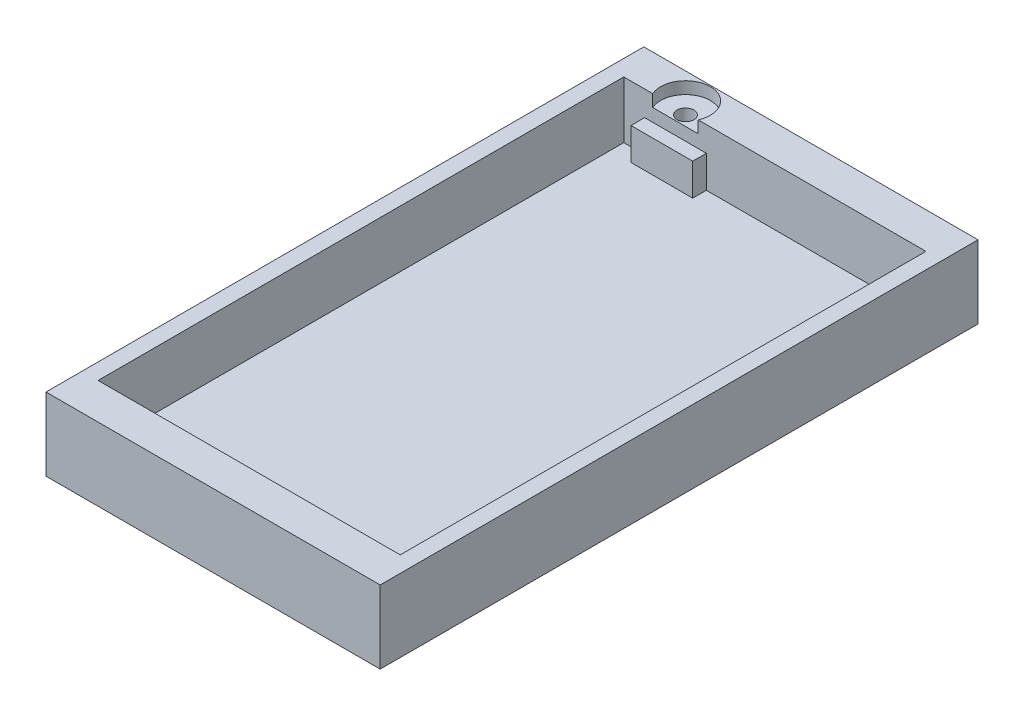
ISO-10303-21;
HEADER;
FILE_DESCRIPTION(('STEP AP214'),'2;1');
FILE_NAME('part.step','',(''),(''),'','','');
FILE_SCHEMA(('AUTOMOTIVE_DESIGN { 1 0 10303 214 1 1 1 1 }'));
ENDSEC;
DATA;
#1=APPLICATION_CONTEXT('core data for automotive mechanical design processes');
#2=APPLICATION_PROTOCOL_DEFINITION('international standard','automotive_design',2000,#1);
#3=PRODUCT_CONTEXT('',#1,'mechanical');
#4=PRODUCT('Part','Part','',(#3));
#5=PRODUCT_RELATED_PRODUCT_CATEGORY('part','',(#4));
#6=PRODUCT_DEFINITION_FORMATION('','',#4);
#7=PRODUCT_DEFINITION_CONTEXT('part definition',#1,'design');
#8=PRODUCT_DEFINITION('design','',#6,#7);
#9=PRODUCT_DEFINITION_SHAPE('','',#8);
#10=(LENGTH_UNIT() NAMED_UNIT(*) SI_UNIT(.MILLI.,.METRE.));
#11=(NAMED_UNIT(*) PLANE_ANGLE_UNIT() SI_UNIT($,.RADIAN.));
#12=(NAMED_UNIT(*) SI_UNIT($,.STERADIAN.) SOLID_ANGLE_UNIT());
#13=UNCERTAINTY_MEASURE_WITH_UNIT(LENGTH_MEASURE(1.E-05),#10,'distance_accuracy_value','');
#14=(GEOMETRIC_REPRESENTATION_CONTEXT(3) GLOBAL_UNCERTAINTY_ASSIGNED_CONTEXT((#13)) GLOBAL_UNIT_ASSIGNED_CONTEXT((#10,
#11,#12)) REPRESENTATION_CONTEXT('',''));
#15=CARTESIAN_POINT('',(0.,0.,0.));
#16=DIRECTION('',(0.,0.,1.));
#17=DIRECTION('',(1.,0.,0.));
#18=AXIS2_PLACEMENT_3D('',#15,#16,#17);
#19=CARTESIAN_POINT('',(0.,3.1,0.));
#20=DIRECTION('',(0.,1.,0.));
#21=DIRECTION('',(0.,0.,1.));
#22=AXIS2_PLACEMENT_3D('',#19,#20,#21);
#23=PLANE('',#22);
#24=DIRECTION('',(0.,0.,1.));
#25=VECTOR('',#24,1.);
#26=CARTESIAN_POINT('',(-20.85,3.1,-37.3));
#27=LINE('',#26,#25);
#28=CARTESIAN_POINT('',(-20.85,3.1,-37.3));
#29=VERTEX_POINT('',#28);
#30=CARTESIAN_POINT('',(-20.85,3.1,37.3));
#31=VERTEX_POINT('',#30);
#32=EDGE_CURVE('E208',#29,#31,#27,.T.);
#33=ORIENTED_EDGE('',*,*,#32,.T.);
#34=DIRECTION('',(1.,0.,0.));
#35=VECTOR('',#34,1.);
#36=CARTESIAN_POINT('',(-20.85,3.1,37.3));
#37=LINE('',#36,#35);
#38=CARTESIAN_POINT('',(20.85,3.1,37.3));
#39=VERTEX_POINT('',#38);
#40=EDGE_CURVE('E202',#31,#39,#37,.T.);
#41=ORIENTED_EDGE('',*,*,#40,.T.);
#42=DIRECTION('',(0.,0.,-1.));
#43=VECTOR('',#42,1.);
#44=CARTESIAN_POINT('',(20.85,3.1,-37.3));
#45=LINE('',#44,#43);
#46=CARTESIAN_POINT('',(20.85,3.1,-37.3));
#47=VERTEX_POINT('',#46);
#48=EDGE_CURVE('E205',#39,#47,#45,.T.);
#49=ORIENTED_EDGE('',*,*,#48,.T.);
#50=DIRECTION('',(-1.,0.,0.));
#51=VECTOR('',#50,1.);
#52=CARTESIAN_POINT('',(-20.85,3.1,-37.3));
#53=LINE('',#52,#51);
#54=EDGE_CURVE('E200',#47,#29,#53,.T.);
#55=ORIENTED_EDGE('',*,*,#54,.T.);
#56=EDGE_LOOP('',(#33,#41,#49,#55));
#57=FACE_BOUND('',#56,.T.);
#58=CARTESIAN_POINT('',(-12.4,3.1,-34.05));
#59=DIRECTION('',(0.,1.,0.));
#60=DIRECTION('',(0.,0.,1.));
#61=AXIS2_PLACEMENT_3D('',#58,#59,#60);
#62=CIRCLE('',#61,3.1);
#63=CARTESIAN_POINT('',(-9.56318840949914,3.1,-32.8));
#64=VERTEX_POINT('',#63);
#65=CARTESIAN_POINT('',(-15.2368115905009,3.1,-32.8));
#66=VERTEX_POINT('',#65);
#67=EDGE_CURVE('E175',#64,#66,#62,.T.);
#68=ORIENTED_EDGE('',*,*,#67,.F.);
#69=DIRECTION('',(-1.,0.,0.));
#70=VECTOR('',#69,1.);
#71=CARTESIAN_POINT('',(-18.85,3.1,-32.8));
#72=LINE('',#71,#70);
#73=CARTESIAN_POINT('',(18.85,3.1,-32.8));
#74=VERTEX_POINT('',#73);
#75=EDGE_CURVE('E180',#74,#64,#72,.T.);
#76=ORIENTED_EDGE('',*,*,#75,.F.);
#77=DIRECTION('',(0.,0.,-1.));
#78=VECTOR('',#77,1.);
#79=CARTESIAN_POINT('',(18.85,3.1,-32.8));
#80=LINE('',#79,#78);
#81=CARTESIAN_POINT('',(18.85,3.1,32.8));
#82=VERTEX_POINT('',#81);
#83=EDGE_CURVE('E225',#82,#74,#80,.T.);
#84=ORIENTED_EDGE('',*,*,#83,.F.);
#85=DIRECTION('',(1.,0.,0.));
#86=VECTOR('',#85,1.);
#87=CARTESIAN_POINT('',(-18.85,3.1,32.8));
#88=LINE('',#87,#86);
#89=CARTESIAN_POINT('',(-18.85,3.1,32.8));
#90=VERTEX_POINT('',#89);
#91=EDGE_CURVE('E223',#90,#82,#88,.T.);
#92=ORIENTED_EDGE('',*,*,#91,.F.);
#93=DIRECTION('',(0.,0.,1.));
#94=VECTOR('',#93,1.);
#95=CARTESIAN_POINT('',(-18.85,3.1,-32.8));
#96=LINE('',#95,#94);
#97=CARTESIAN_POINT('',(-18.85,3.1,-32.8));
#98=VERTEX_POINT('',#97);
#99=EDGE_CURVE('E230',#98,#90,#96,.T.);
#100=ORIENTED_EDGE('',*,*,#99,.F.);
#101=EDGE_CURVE('E222',#66,#98,#72,.T.);
#102=ORIENTED_EDGE('',*,*,#101,.F.);
#103=EDGE_LOOP('',(#68,#76,#84,#92,#100,#102));
#104=FACE_BOUND('',#103,.T.);
#105=ADVANCED_FACE('F39',(#57,#104),#23,.T.);
#106=CARTESIAN_POINT('',(-18.85,3.1,-32.8));
#107=DIRECTION('',(0.,0.,1.));
#108=DIRECTION('',(1.,0.,0.));
#109=AXIS2_PLACEMENT_3D('',#106,#107,#108);
#110=PLANE('',#109);
#111=DIRECTION('',(-1.,0.,0.));
#112=VECTOR('',#111,1.);
#113=CARTESIAN_POINT('',(-18.85,1.6,-32.8));
#114=LINE('',#113,#112);
#115=CARTESIAN_POINT('',(-9.56318840949914,1.6,-32.8));
#116=VERTEX_POINT('',#115);
#117=CARTESIAN_POINT('',(-15.2368115905009,1.6,-32.8));
#118=VERTEX_POINT('',#117);
#119=EDGE_CURVE('E163',#116,#118,#114,.T.);
#120=ORIENTED_EDGE('',*,*,#119,.T.);
#121=DIRECTION('',(0.,-1.,0.));
#122=VECTOR('',#121,1.);
#123=CARTESIAN_POINT('',(-15.2368115905009,3.1,-32.8));
#124=LINE('',#123,#122);
#125=EDGE_CURVE('E11',#118,#66,#124,.F.);
#126=ORIENTED_EDGE('',*,*,#125,.T.);
#127=ORIENTED_EDGE('',*,*,#101,.T.);
#128=DIRECTION('',(0.,-1.,0.));
#129=VECTOR('',#128,1.);
#130=CARTESIAN_POINT('',(-18.85,3.1,-32.8));
#131=LINE('',#130,#129);
#132=CARTESIAN_POINT('',(-18.85,-4.,-32.8));
#133=VERTEX_POINT('',#132);
#134=EDGE_CURVE('E220',#98,#133,#131,.T.);
#135=ORIENTED_EDGE('',*,*,#134,.T.);
#136=DIRECTION('',(-1.,0.,0.));
#137=VECTOR('',#136,1.);
#138=CARTESIAN_POINT('',(-18.85,-4.,-32.8));
#139=LINE('',#138,#137);
#140=CARTESIAN_POINT('',(-16.25,-4.,-32.8));
#141=VERTEX_POINT('',#140);
#142=EDGE_CURVE('E235',#141,#133,#139,.T.);
#143=ORIENTED_EDGE('',*,*,#142,.F.);
#144=DIRECTION('',(0.,1.,0.));
#145=VECTOR('',#144,1.);
#146=CARTESIAN_POINT('',(-16.25,-4.,-32.8));
#147=LINE('',#146,#145);
#148=CARTESIAN_POINT('',(-16.25,0.,-32.8));
#149=VERTEX_POINT('',#148);
#150=EDGE_CURVE('E65',#141,#149,#147,.T.);
#151=ORIENTED_EDGE('',*,*,#150,.T.);
#152=DIRECTION('',(-1.,0.,0.));
#153=VECTOR('',#152,1.);
#154=CARTESIAN_POINT('',(-16.25,0.,-32.8));
#155=LINE('',#154,#153);
#156=CARTESIAN_POINT('',(-8.55,0.,-32.8));
#157=VERTEX_POINT('',#156);
#158=EDGE_CURVE('E285',#157,#149,#155,.T.);
#159=ORIENTED_EDGE('',*,*,#158,.F.);
#160=DIRECTION('',(0.,1.,0.));
#161=VECTOR('',#160,1.);
#162=CARTESIAN_POINT('',(-8.55,-4.,-32.8));
#163=LINE('',#162,#161);
#164=CARTESIAN_POINT('',(-8.55,-4.,-32.8));
#165=VERTEX_POINT('',#164);
#166=EDGE_CURVE('E279',#165,#157,#163,.T.);
#167=ORIENTED_EDGE('',*,*,#166,.F.);
#168=CARTESIAN_POINT('',(18.85,-4.,-32.8));
#169=VERTEX_POINT('',#168);
#170=EDGE_CURVE('E228',#169,#165,#139,.T.);
#171=ORIENTED_EDGE('',*,*,#170,.F.);
#172=DIRECTION('',(0.,-1.,0.));
#173=VECTOR('',#172,1.);
#174=CARTESIAN_POINT('',(18.85,3.1,-32.8));
#175=LINE('',#174,#173);
#176=EDGE_CURVE('E214',#74,#169,#175,.T.);
#177=ORIENTED_EDGE('',*,*,#176,.F.);
#178=ORIENTED_EDGE('',*,*,#75,.T.);
#179=DIRECTION('',(0.,-1.,0.));
#180=VECTOR('',#179,1.);
#181=CARTESIAN_POINT('',(-9.56318840949914,3.1,-32.8));
#182=LINE('',#181,#180);
#183=EDGE_CURVE('E48',#64,#116,#182,.T.);
#184=ORIENTED_EDGE('',*,*,#183,.T.);
#185=EDGE_LOOP('',(#120,#126,#127,#135,#143,#151,#159,#167,#171,#177,#178,#184));
#186=FACE_BOUND('',#185,.T.);
#187=ADVANCED_FACE('F174',(#186),#110,.T.);
#188=CARTESIAN_POINT('',(-18.85,3.1,32.8));
#189=DIRECTION('',(0.,0.,-1.));
#190=DIRECTION('',(-1.,0.,0.));
#191=AXIS2_PLACEMENT_3D('',#188,#189,#190);
#192=PLANE('',#191);
#193=DIRECTION('',(0.,-1.,0.));
#194=VECTOR('',#193,1.);
#195=CARTESIAN_POINT('',(-18.85,3.1,32.8));
#196=LINE('',#195,#194);
#197=CARTESIAN_POINT('',(-18.85,-4.,32.8));
#198=VERTEX_POINT('',#197);
#199=EDGE_CURVE('E211',#90,#198,#196,.T.);
#200=ORIENTED_EDGE('',*,*,#199,.F.);
#201=ORIENTED_EDGE('',*,*,#91,.T.);
#202=DIRECTION('',(0.,-1.,0.));
#203=VECTOR('',#202,1.);
#204=CARTESIAN_POINT('',(18.85,3.1,32.8));
#205=LINE('',#204,#203);
#206=CARTESIAN_POINT('',(18.85,-4.,32.8));
#207=VERTEX_POINT('',#206);
#208=EDGE_CURVE('E213',#82,#207,#205,.T.);
#209=ORIENTED_EDGE('',*,*,#208,.T.);
#210=DIRECTION('',(1.,0.,0.));
#211=VECTOR('',#210,1.);
#212=CARTESIAN_POINT('',(-18.85,-4.,32.8));
#213=LINE('',#212,#211);
#214=EDGE_CURVE('E237',#198,#207,#213,.T.);
#215=ORIENTED_EDGE('',*,*,#214,.F.);
#216=EDGE_LOOP('',(#200,#201,#209,#215));
#217=FACE_BOUND('',#216,.T.);
#218=DIRECTION('',(0.,-1.,0.));
#219=VECTOR('',#218,1.);
#220=CARTESIAN_POINT('',(18.4,1.75,32.8));
#221=LINE('',#220,#219);
#222=CARTESIAN_POINT('',(18.4,1.75,32.8));
#223=VERTEX_POINT('',#222);
#224=CARTESIAN_POINT('',(18.4,-0.15,32.8));
#225=VERTEX_POINT('',#224);
#226=EDGE_CURVE('E247',#223,#225,#221,.T.);
#227=ORIENTED_EDGE('',*,*,#226,.F.);
#228=DIRECTION('',(-1.,0.,0.));
#229=VECTOR('',#228,1.);
#230=CARTESIAN_POINT('',(-18.4,1.75,32.8));
#231=LINE('',#230,#229);
#232=CARTESIAN_POINT('',(-18.4,1.75,32.8));
#233=VERTEX_POINT('',#232);
#234=EDGE_CURVE('E252',#223,#233,#231,.T.);
#235=ORIENTED_EDGE('',*,*,#234,.T.);
#236=DIRECTION('',(0.,-1.,0.));
#237=VECTOR('',#236,1.);
#238=CARTESIAN_POINT('',(-18.4,1.75,32.8));
#239=LINE('',#238,#237);
#240=CARTESIAN_POINT('',(-18.4,-0.15,32.8));
#241=VERTEX_POINT('',#240);
#242=EDGE_CURVE('E246',#233,#241,#239,.T.);
#243=ORIENTED_EDGE('',*,*,#242,.T.);
#244=DIRECTION('',(-1.,0.,0.));
#245=VECTOR('',#244,1.);
#246=CARTESIAN_POINT('',(-18.4,-0.15,32.8));
#247=LINE('',#246,#245);
#248=EDGE_CURVE('E265',#225,#241,#247,.T.);
#249=ORIENTED_EDGE('',*,*,#248,.F.);
#250=EDGE_LOOP('',(#227,#235,#243,#249));
#251=FACE_BOUND('',#250,.T.);
#252=ADVANCED_FACE('F328',(#217,#251),#192,.T.);
#253=CARTESIAN_POINT('',(-20.85,-6.,-37.3));
#254=DIRECTION('',(-1.,0.,0.));
#255=DIRECTION('',(0.,0.,1.));
#256=AXIS2_PLACEMENT_3D('',#253,#254,#255);
#257=PLANE('',#256);
#258=DIRECTION('',(0.,1.,0.));
#259=VECTOR('',#258,1.);
#260=CARTESIAN_POINT('',(-20.85,-6.,37.3));
#261=LINE('',#260,#259);
#262=CARTESIAN_POINT('',(-20.85,-6.,37.3));
#263=VERTEX_POINT('',#262);
#264=EDGE_CURVE('E178',#263,#31,#261,.T.);
#265=ORIENTED_EDGE('',*,*,#264,.T.);
#266=ORIENTED_EDGE('',*,*,#32,.F.);
#267=DIRECTION('',(0.,1.,0.));
#268=VECTOR('',#267,1.);
#269=CARTESIAN_POINT('',(-20.85,-6.,-37.3));
#270=LINE('',#269,#268);
#271=CARTESIAN_POINT('',(-20.85,-6.,-37.3));
#272=VERTEX_POINT('',#271);
#273=EDGE_CURVE('E170',#272,#29,#270,.T.);
#274=ORIENTED_EDGE('',*,*,#273,.F.);
#275=DIRECTION('',(0.,0.,1.));
#276=VECTOR('',#275,1.);
#277=CARTESIAN_POINT('',(-20.85,-6.,-37.3));
#278=LINE('',#277,#276);
#279=EDGE_CURVE('E198',#272,#263,#278,.T.);
#280=ORIENTED_EDGE('',*,*,#279,.T.);
#281=EDGE_LOOP('',(#265,#266,#274,#280));
#282=FACE_BOUND('',#281,.T.);
#283=ADVANCED_FACE('F41',(#282),#257,.T.);
#284=CARTESIAN_POINT('',(-20.85,-6.,-37.3));
#285=DIRECTION('',(0.,0.,-1.));
#286=DIRECTION('',(-1.,0.,0.));
#287=AXIS2_PLACEMENT_3D('',#284,#285,#286);
#288=PLANE('',#287);
#289=ORIENTED_EDGE('',*,*,#273,.T.);
#290=ORIENTED_EDGE('',*,*,#54,.F.);
#291=DIRECTION('',(0.,1.,0.));
#292=VECTOR('',#291,1.);
#293=CARTESIAN_POINT('',(20.85,-6.,-37.3));
#294=LINE('',#293,#292);
#295=CARTESIAN_POINT('',(20.85,-6.,-37.3));
#296=VERTEX_POINT('',#295);
#297=EDGE_CURVE('E183',#296,#47,#294,.T.);
#298=ORIENTED_EDGE('',*,*,#297,.F.);
#299=DIRECTION('',(-1.,0.,0.));
#300=VECTOR('',#299,1.);
#301=CARTESIAN_POINT('',(-20.85,-6.,-37.3));
#302=LINE('',#301,#300);
#303=EDGE_CURVE('E181',#296,#272,#302,.T.);
#304=ORIENTED_EDGE('',*,*,#303,.T.);
#305=EDGE_LOOP('',(#289,#290,#298,#304));
#306=FACE_BOUND('',#305,.T.);
#307=ADVANCED_FACE('F342',(#306),#288,.T.);
#308=CARTESIAN_POINT('',(20.85,-6.,-37.3));
#309=DIRECTION('',(1.,0.,0.));
#310=DIRECTION('',(0.,0.,-1.));
#311=AXIS2_PLACEMENT_3D('',#308,#309,#310);
#312=PLANE('',#311);
#313=ORIENTED_EDGE('',*,*,#297,.T.);
#314=ORIENTED_EDGE('',*,*,#48,.F.);
#315=DIRECTION('',(0.,1.,0.));
#316=VECTOR('',#315,1.);
#317=CARTESIAN_POINT('',(20.85,-6.,37.3));
#318=LINE('',#317,#316);
#319=CARTESIAN_POINT('',(20.85,-6.,37.3));
#320=VERTEX_POINT('',#319);
#321=EDGE_CURVE('E185',#320,#39,#318,.T.);
#322=ORIENTED_EDGE('',*,*,#321,.F.);
#323=DIRECTION('',(0.,0.,-1.));
#324=VECTOR('',#323,1.);
#325=CARTESIAN_POINT('',(20.85,-6.,-37.3));
#326=LINE('',#325,#324);
#327=EDGE_CURVE('E189',#320,#296,#326,.T.);
#328=ORIENTED_EDGE('',*,*,#327,.T.);
#329=EDGE_LOOP('',(#313,#314,#322,#328));
#330=FACE_BOUND('',#329,.T.);
#331=ADVANCED_FACE('F341',(#330),#312,.T.);
#332=CARTESIAN_POINT('',(-20.85,-6.,37.3));
#333=DIRECTION('',(0.,0.,1.));
#334=DIRECTION('',(1.,0.,0.));
#335=AXIS2_PLACEMENT_3D('',#332,#333,#334);
#336=PLANE('',#335);
#337=ORIENTED_EDGE('',*,*,#321,.T.);
#338=ORIENTED_EDGE('',*,*,#40,.F.);
#339=ORIENTED_EDGE('',*,*,#264,.F.);
#340=DIRECTION('',(1.,0.,0.));
#341=VECTOR('',#340,1.);
#342=CARTESIAN_POINT('',(-20.85,-6.,37.3));
#343=LINE('',#342,#341);
#344=EDGE_CURVE('E194',#263,#320,#343,.T.);
#345=ORIENTED_EDGE('',*,*,#344,.T.);
#346=EDGE_LOOP('',(#337,#338,#339,#345));
#347=FACE_BOUND('',#346,.T.);
#348=ADVANCED_FACE('F338',(#347),#336,.T.);
#349=CARTESIAN_POINT('',(0.,-6.,0.));
#350=DIRECTION('',(0.,1.,0.));
#351=DIRECTION('',(0.,0.,1.));
#352=AXIS2_PLACEMENT_3D('',#349,#350,#351);
#353=PLANE('',#352);
#354=ORIENTED_EDGE('',*,*,#279,.F.);
#355=ORIENTED_EDGE('',*,*,#303,.F.);
#356=ORIENTED_EDGE('',*,*,#327,.F.);
#357=ORIENTED_EDGE('',*,*,#344,.F.);
#358=EDGE_LOOP('',(#354,#355,#356,#357));
#359=FACE_BOUND('',#358,.T.);
#360=ADVANCED_FACE('F336',(#359),#353,.F.);
#361=CARTESIAN_POINT('',(-18.85,3.1,-32.8));
#362=DIRECTION('',(1.,0.,0.));
#363=DIRECTION('',(0.,0.,-1.));
#364=AXIS2_PLACEMENT_3D('',#361,#362,#363);
#365=PLANE('',#364);
#366=ORIENTED_EDGE('',*,*,#134,.F.);
#367=ORIENTED_EDGE('',*,*,#99,.T.);
#368=ORIENTED_EDGE('',*,*,#199,.T.);
#369=DIRECTION('',(0.,0.,1.));
#370=VECTOR('',#369,1.);
#371=CARTESIAN_POINT('',(-18.85,-4.,-32.8));
#372=LINE('',#371,#370);
#373=EDGE_CURVE('E239',#133,#198,#372,.T.);
#374=ORIENTED_EDGE('',*,*,#373,.F.);
#375=EDGE_LOOP('',(#366,#367,#368,#374));
#376=FACE_BOUND('',#375,.T.);
#377=ADVANCED_FACE('F331',(#376),#365,.T.);
#378=CARTESIAN_POINT('',(18.85,3.1,-32.8));
#379=DIRECTION('',(-1.,0.,0.));
#380=DIRECTION('',(0.,0.,1.));
#381=AXIS2_PLACEMENT_3D('',#378,#379,#380);
#382=PLANE('',#381);
#383=ORIENTED_EDGE('',*,*,#208,.F.);
#384=ORIENTED_EDGE('',*,*,#83,.T.);
#385=ORIENTED_EDGE('',*,*,#176,.T.);
#386=DIRECTION('',(0.,0.,-1.));
#387=VECTOR('',#386,1.);
#388=CARTESIAN_POINT('',(18.85,-4.,-32.8));
#389=LINE('',#388,#387);
#390=EDGE_CURVE('E234',#207,#169,#389,.T.);
#391=ORIENTED_EDGE('',*,*,#390,.F.);
#392=EDGE_LOOP('',(#383,#384,#385,#391));
#393=FACE_BOUND('',#392,.T.);
#394=ADVANCED_FACE('F373',(#393),#382,.T.);
#395=CARTESIAN_POINT('',(0.,-4.,0.));
#396=DIRECTION('',(0.,1.,0.));
#397=DIRECTION('',(0.,0.,1.));
#398=AXIS2_PLACEMENT_3D('',#395,#396,#397);
#399=PLANE('',#398);
#400=DIRECTION('',(0.,0.,1.));
#401=VECTOR('',#400,1.);
#402=CARTESIAN_POINT('',(-16.25,-4.,-32.8));
#403=LINE('',#402,#401);
#404=CARTESIAN_POINT('',(-16.25,-4.,-31.1));
#405=VERTEX_POINT('',#404);
#406=EDGE_CURVE('E284',#141,#405,#403,.T.);
#407=ORIENTED_EDGE('',*,*,#406,.F.);
#408=ORIENTED_EDGE('',*,*,#142,.T.);
#409=ORIENTED_EDGE('',*,*,#373,.T.);
#410=ORIENTED_EDGE('',*,*,#214,.T.);
#411=ORIENTED_EDGE('',*,*,#390,.T.);
#412=ORIENTED_EDGE('',*,*,#170,.T.);
#413=DIRECTION('',(0.,0.,-1.));
#414=VECTOR('',#413,1.);
#415=CARTESIAN_POINT('',(-8.55,-4.,-32.8));
#416=LINE('',#415,#414);
#417=CARTESIAN_POINT('',(-8.55,-4.,-31.1));
#418=VERTEX_POINT('',#417);
#419=EDGE_CURVE('E277',#418,#165,#416,.T.);
#420=ORIENTED_EDGE('',*,*,#419,.F.);
#421=DIRECTION('',(1.,0.,0.));
#422=VECTOR('',#421,1.);
#423=CARTESIAN_POINT('',(-16.25,-4.,-31.1));
#424=LINE('',#423,#422);
#425=EDGE_CURVE('E300',#405,#418,#424,.T.);
#426=ORIENTED_EDGE('',*,*,#425,.F.);
#427=EDGE_LOOP('',(#407,#408,#409,#410,#411,#412,#420,#426));
#428=FACE_BOUND('',#427,.T.);
#429=ADVANCED_FACE('F372',(#428),#399,.T.);
#430=CARTESIAN_POINT('',(-18.4,1.75,32.8));
#431=DIRECTION('',(1.,0.,0.));
#432=DIRECTION('',(0.,0.,-1.));
#433=AXIS2_PLACEMENT_3D('',#430,#431,#432);
#434=PLANE('',#433);
#435=ORIENTED_EDGE('',*,*,#242,.F.);
#436=DIRECTION('',(0.,0.,1.));
#437=VECTOR('',#436,1.);
#438=CARTESIAN_POINT('',(-18.4,1.75,32.8));
#439=LINE('',#438,#437);
#440=CARTESIAN_POINT('',(-18.4,1.75,34.8));
#441=VERTEX_POINT('',#440);
#442=EDGE_CURVE('E259',#233,#441,#439,.T.);
#443=ORIENTED_EDGE('',*,*,#442,.T.);
#444=DIRECTION('',(0.,-1.,0.));
#445=VECTOR('',#444,1.);
#446=CARTESIAN_POINT('',(-18.4,1.75,34.8));
#447=LINE('',#446,#445);
#448=CARTESIAN_POINT('',(-18.4,-0.15,34.8));
#449=VERTEX_POINT('',#448);
#450=EDGE_CURVE('E245',#441,#449,#447,.T.);
#451=ORIENTED_EDGE('',*,*,#450,.T.);
#452=DIRECTION('',(0.,0.,1.));
#453=VECTOR('',#452,1.);
#454=CARTESIAN_POINT('',(-18.4,-0.15,32.8));
#455=LINE('',#454,#453);
#456=EDGE_CURVE('E269',#241,#449,#455,.T.);
#457=ORIENTED_EDGE('',*,*,#456,.F.);
#458=EDGE_LOOP('',(#435,#443,#451,#457));
#459=FACE_BOUND('',#458,.T.);
#460=ADVANCED_FACE('F377',(#459),#434,.T.);
#461=CARTESIAN_POINT('',(-18.4,1.75,34.8));
#462=DIRECTION('',(0.,0.,-1.));
#463=DIRECTION('',(-1.,0.,0.));
#464=AXIS2_PLACEMENT_3D('',#461,#462,#463);
#465=PLANE('',#464);
#466=ORIENTED_EDGE('',*,*,#450,.F.);
#467=DIRECTION('',(1.,0.,0.));
#468=VECTOR('',#467,1.);
#469=CARTESIAN_POINT('',(-18.4,1.75,34.8));
#470=LINE('',#469,#468);
#471=CARTESIAN_POINT('',(18.4,1.75,34.8));
#472=VERTEX_POINT('',#471);
#473=EDGE_CURVE('E260',#441,#472,#470,.T.);
#474=ORIENTED_EDGE('',*,*,#473,.T.);
#475=DIRECTION('',(0.,-1.,0.));
#476=VECTOR('',#475,1.);
#477=CARTESIAN_POINT('',(18.4,1.75,34.8));
#478=LINE('',#477,#476);
#479=CARTESIAN_POINT('',(18.4,-0.15,34.8));
#480=VERTEX_POINT('',#479);
#481=EDGE_CURVE('E243',#472,#480,#478,.T.);
#482=ORIENTED_EDGE('',*,*,#481,.T.);
#483=DIRECTION('',(1.,0.,0.));
#484=VECTOR('',#483,1.);
#485=CARTESIAN_POINT('',(-18.4,-0.15,34.8));
#486=LINE('',#485,#484);
#487=EDGE_CURVE('E270',#449,#480,#486,.T.);
#488=ORIENTED_EDGE('',*,*,#487,.F.);
#489=EDGE_LOOP('',(#466,#474,#482,#488));
#490=FACE_BOUND('',#489,.T.);
#491=ADVANCED_FACE('F385',(#490),#465,.T.);
#492=CARTESIAN_POINT('',(18.4,1.75,32.8));
#493=DIRECTION('',(-1.,0.,0.));
#494=DIRECTION('',(0.,0.,1.));
#495=AXIS2_PLACEMENT_3D('',#492,#493,#494);
#496=PLANE('',#495);
#497=ORIENTED_EDGE('',*,*,#481,.F.);
#498=DIRECTION('',(0.,0.,-1.));
#499=VECTOR('',#498,1.);
#500=CARTESIAN_POINT('',(18.4,1.75,32.8));
#501=LINE('',#500,#499);
#502=EDGE_CURVE('E254',#472,#223,#501,.T.);
#503=ORIENTED_EDGE('',*,*,#502,.T.);
#504=ORIENTED_EDGE('',*,*,#226,.T.);
#505=DIRECTION('',(0.,0.,-1.));
#506=VECTOR('',#505,1.);
#507=CARTESIAN_POINT('',(18.4,-0.15,32.8));
#508=LINE('',#507,#506);
#509=EDGE_CURVE('E264',#480,#225,#508,.T.);
#510=ORIENTED_EDGE('',*,*,#509,.F.);
#511=EDGE_LOOP('',(#497,#503,#504,#510));
#512=FACE_BOUND('',#511,.T.);
#513=ADVANCED_FACE('F387',(#512),#496,.T.);
#514=CARTESIAN_POINT('',(0.,1.75,0.));
#515=DIRECTION('',(0.,1.,0.));
#516=DIRECTION('',(0.,0.,1.));
#517=AXIS2_PLACEMENT_3D('',#514,#515,#516);
#518=PLANE('',#517);
#519=ORIENTED_EDGE('',*,*,#442,.F.);
#520=ORIENTED_EDGE('',*,*,#234,.F.);
#521=ORIENTED_EDGE('',*,*,#502,.F.);
#522=ORIENTED_EDGE('',*,*,#473,.F.);
#523=EDGE_LOOP('',(#519,#520,#521,#522));
#524=FACE_BOUND('',#523,.T.);
#525=ADVANCED_FACE('F388',(#524),#518,.F.);
#526=CARTESIAN_POINT('',(0.,-0.15,0.));
#527=DIRECTION('',(0.,1.,0.));
#528=DIRECTION('',(0.,0.,1.));
#529=AXIS2_PLACEMENT_3D('',#526,#527,#528);
#530=PLANE('',#529);
#531=ORIENTED_EDGE('',*,*,#456,.T.);
#532=ORIENTED_EDGE('',*,*,#487,.T.);
#533=ORIENTED_EDGE('',*,*,#509,.T.);
#534=ORIENTED_EDGE('',*,*,#248,.T.);
#535=EDGE_LOOP('',(#531,#532,#533,#534));
#536=FACE_BOUND('',#535,.T.);
#537=ADVANCED_FACE('F393',(#536),#530,.T.);
#538=CARTESIAN_POINT('',(-16.25,-4.,-32.8));
#539=DIRECTION('',(-1.,0.,0.));
#540=DIRECTION('',(0.,0.,1.));
#541=AXIS2_PLACEMENT_3D('',#538,#539,#540);
#542=PLANE('',#541);
#543=DIRECTION('',(0.,0.,1.));
#544=VECTOR('',#543,1.);
#545=CARTESIAN_POINT('',(-16.25,0.,-32.8));
#546=LINE('',#545,#544);
#547=CARTESIAN_POINT('',(-16.25,0.,-31.1));
#548=VERTEX_POINT('',#547);
#549=EDGE_CURVE('E295',#149,#548,#546,.T.);
#550=ORIENTED_EDGE('',*,*,#549,.F.);
#551=ORIENTED_EDGE('',*,*,#150,.F.);
#552=ORIENTED_EDGE('',*,*,#406,.T.);
#553=DIRECTION('',(0.,1.,0.));
#554=VECTOR('',#553,1.);
#555=CARTESIAN_POINT('',(-16.25,-4.,-31.1));
#556=LINE('',#555,#554);
#557=EDGE_CURVE('E272',#405,#548,#556,.T.);
#558=ORIENTED_EDGE('',*,*,#557,.T.);
#559=EDGE_LOOP('',(#550,#551,#552,#558));
#560=FACE_BOUND('',#559,.T.);
#561=ADVANCED_FACE('F399',(#560),#542,.T.);
#562=CARTESIAN_POINT('',(-8.55,-4.,-32.8));
#563=DIRECTION('',(1.,0.,0.));
#564=DIRECTION('',(0.,0.,-1.));
#565=AXIS2_PLACEMENT_3D('',#562,#563,#564);
#566=PLANE('',#565);
#567=DIRECTION('',(0.,0.,-1.));
#568=VECTOR('',#567,1.);
#569=CARTESIAN_POINT('',(-8.55,0.,-32.8));
#570=LINE('',#569,#568);
#571=CARTESIAN_POINT('',(-8.55,0.,-31.1));
#572=VERTEX_POINT('',#571);
#573=EDGE_CURVE('E287',#572,#157,#570,.T.);
#574=ORIENTED_EDGE('',*,*,#573,.F.);
#575=DIRECTION('',(0.,1.,0.));
#576=VECTOR('',#575,1.);
#577=CARTESIAN_POINT('',(-8.55,-4.,-31.1));
#578=LINE('',#577,#576);
#579=EDGE_CURVE('E274',#418,#572,#578,.T.);
#580=ORIENTED_EDGE('',*,*,#579,.F.);
#581=ORIENTED_EDGE('',*,*,#419,.T.);
#582=ORIENTED_EDGE('',*,*,#166,.T.);
#583=EDGE_LOOP('',(#574,#580,#581,#582));
#584=FACE_BOUND('',#583,.T.);
#585=ADVANCED_FACE('F405',(#584),#566,.T.);
#586=CARTESIAN_POINT('',(-16.25,-4.,-31.1));
#587=DIRECTION('',(0.,0.,1.));
#588=DIRECTION('',(1.,0.,0.));
#589=AXIS2_PLACEMENT_3D('',#586,#587,#588);
#590=PLANE('',#589);
#591=DIRECTION('',(1.,0.,0.));
#592=VECTOR('',#591,1.);
#593=CARTESIAN_POINT('',(-16.25,0.,-31.1));
#594=LINE('',#593,#592);
#595=EDGE_CURVE('E286',#548,#572,#594,.T.);
#596=ORIENTED_EDGE('',*,*,#595,.F.);
#597=ORIENTED_EDGE('',*,*,#557,.F.);
#598=ORIENTED_EDGE('',*,*,#425,.T.);
#599=ORIENTED_EDGE('',*,*,#579,.T.);
#600=EDGE_LOOP('',(#596,#597,#598,#599));
#601=FACE_BOUND('',#600,.T.);
#602=ADVANCED_FACE('F404',(#601),#590,.T.);
#603=CARTESIAN_POINT('',(0.,0.,0.));
#604=DIRECTION('',(0.,1.,0.));
#605=DIRECTION('',(0.,0.,1.));
#606=AXIS2_PLACEMENT_3D('',#603,#604,#605);
#607=PLANE('',#606);
#608=ORIENTED_EDGE('',*,*,#549,.T.);
#609=ORIENTED_EDGE('',*,*,#595,.T.);
#610=ORIENTED_EDGE('',*,*,#573,.T.);
#611=ORIENTED_EDGE('',*,*,#158,.T.);
#612=EDGE_LOOP('',(#608,#609,#610,#611));
#613=FACE_BOUND('',#612,.T.);
#614=ADVANCED_FACE('F410',(#613),#607,.T.);
#615=CARTESIAN_POINT('',(-12.4,3.1,-34.05));
#616=DIRECTION('',(0.,-1.,0.));
#617=DIRECTION('',(0.,0.,-1.));
#618=AXIS2_PLACEMENT_3D('',#615,#616,#617);
#619=CYLINDRICAL_SURFACE('',#618,3.1);
#620=CARTESIAN_POINT('',(-12.4,1.6,-34.05));
#621=DIRECTION('',(0.,1.,0.));
#622=DIRECTION('',(0.,0.,1.));
#623=AXIS2_PLACEMENT_3D('',#620,#621,#622);
#624=CIRCLE('',#623,3.1);
#625=EDGE_CURVE('E53',#116,#118,#624,.T.);
#626=ORIENTED_EDGE('',*,*,#625,.F.);
#627=ORIENTED_EDGE('',*,*,#183,.F.);
#628=ORIENTED_EDGE('',*,*,#67,.T.);
#629=ORIENTED_EDGE('',*,*,#125,.F.);
#630=EDGE_LOOP('',(#626,#627,#628,#629));
#631=FACE_BOUND('',#630,.T.);
#632=ADVANCED_FACE('F168',(#631),#619,.F.);
#633=CARTESIAN_POINT('',(-12.4,1.6,-34.05));
#634=DIRECTION('',(0.,1.,0.));
#635=DIRECTION('',(0.,0.,1.));
#636=AXIS2_PLACEMENT_3D('',#633,#634,#635);
#637=PLANE('',#636);
#638=CARTESIAN_POINT('',(-12.4,1.6,-34.05));
#639=DIRECTION('',(0.,1.,0.));
#640=DIRECTION('',(0.,0.,1.));
#641=AXIS2_PLACEMENT_3D('',#638,#639,#640);
#642=CIRCLE('',#641,1.05);
#643=CARTESIAN_POINT('',(-12.4,1.6,-33.));
#644=VERTEX_POINT('',#643);
#645=EDGE_CURVE('E43',#644,#644,#642,.F.);
#646=ORIENTED_EDGE('',*,*,#645,.T.);
#647=EDGE_LOOP('',(#646));
#648=FACE_BOUND('',#647,.T.);
#649=ORIENTED_EDGE('',*,*,#625,.T.);
#650=ORIENTED_EDGE('',*,*,#119,.F.);
#651=EDGE_LOOP('',(#649,#650));
#652=FACE_BOUND('',#651,.T.);
#653=ADVANCED_FACE('F164',(#648,#652),#637,.T.);
#654=CARTESIAN_POINT('',(-12.4,3.1,-34.05));
#655=DIRECTION('',(0.,-1.,0.));
#656=DIRECTION('',(0.,0.,-1.));
#657=AXIS2_PLACEMENT_3D('',#654,#655,#656);
#658=CYLINDRICAL_SURFACE('',#657,1.05);
#659=ORIENTED_EDGE('',*,*,#645,.F.);
#660=EDGE_LOOP('',(#659));
#661=FACE_BOUND('',#660,.T.);
#662=CARTESIAN_POINT('',(-12.4,-5.,-34.05));
#663=DIRECTION('',(0.,1.,0.));
#664=DIRECTION('',(0.,0.,1.));
#665=AXIS2_PLACEMENT_3D('',#662,#663,#664);
#666=CIRCLE('',#665,1.05);
#667=CARTESIAN_POINT('',(-12.4,-5.,-33.));
#668=VERTEX_POINT('',#667);
#669=EDGE_CURVE('E304',#668,#668,#666,.T.);
#670=ORIENTED_EDGE('',*,*,#669,.F.);
#671=EDGE_LOOP('',(#670));
#672=FACE_BOUND('',#671,.T.);
#673=ADVANCED_FACE('F313',(#661,#672),#658,.F.);
#674=CARTESIAN_POINT('',(-12.4,-5.,-34.05));
#675=DIRECTION('',(0.,1.,0.));
#676=DIRECTION('',(0.,0.,1.));
#677=AXIS2_PLACEMENT_3D('',#674,#675,#676);
#678=PLANE('',#677);
#679=ORIENTED_EDGE('',*,*,#669,.T.);
#680=EDGE_LOOP('',(#679));
#681=FACE_BOUND('',#680,.T.);
#682=ADVANCED_FACE('F314',(#681),#678,.T.);
#683=CLOSED_SHELL('',(#105,#187,#252,#283,#307,#331,#348,#360,#377,#394,#429,#460,#491,#513,
#525,#537,#561,#585,#602,#614,#632,#653,#673,#682));
#684=MANIFOLD_SOLID_BREP('B2',#683);
#685=ADVANCED_BREP_SHAPE_REPRESENTATION('',(#18,#684),#14);
#686=SHAPE_DEFINITION_REPRESENTATION(#9,#685);
ENDSEC;
END-ISO-10303-21;
